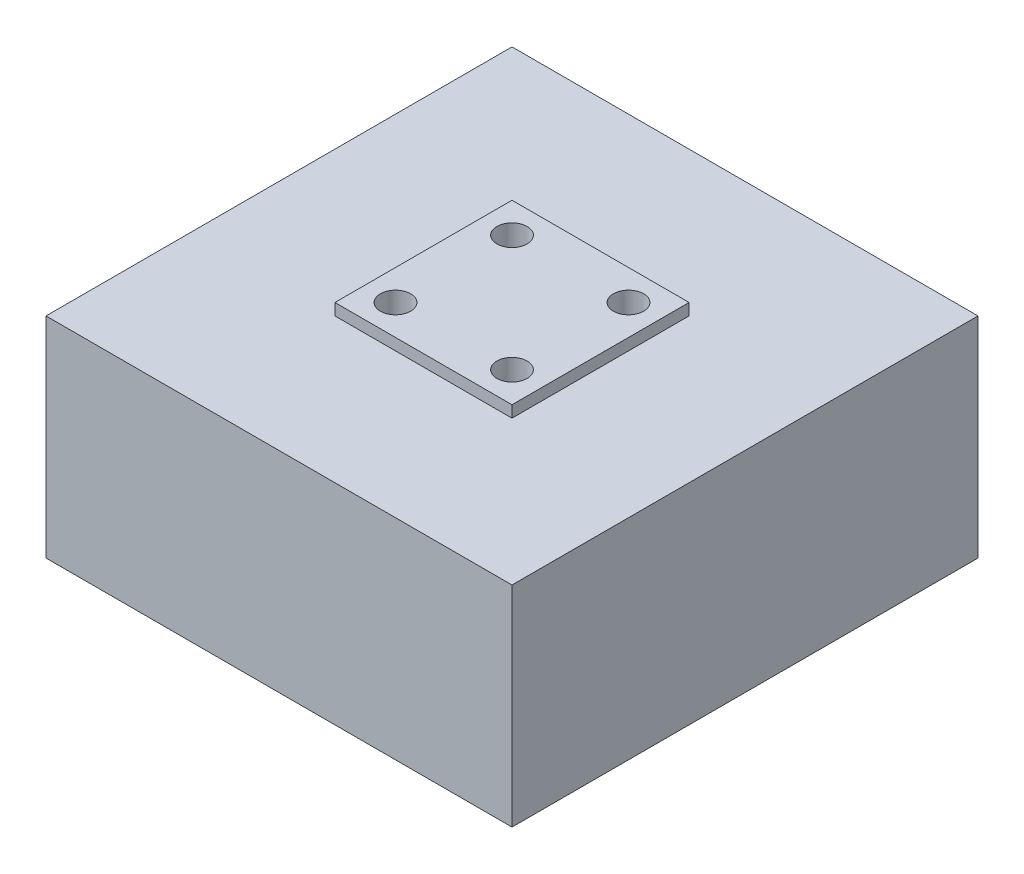
ISO-10303-21;
HEADER;
FILE_DESCRIPTION(('STEP AP214'),'2;1');
FILE_NAME('part.step','',(''),(''),'','','');
FILE_SCHEMA(('AUTOMOTIVE_DESIGN { 1 0 10303 214 1 1 1 1 }'));
ENDSEC;
DATA;
#1=APPLICATION_CONTEXT('core data for automotive mechanical design processes');
#2=APPLICATION_PROTOCOL_DEFINITION('international standard','automotive_design',2000,#1);
#3=PRODUCT_CONTEXT('',#1,'mechanical');
#4=PRODUCT('Part','Part','',(#3));
#5=PRODUCT_RELATED_PRODUCT_CATEGORY('part','',(#4));
#6=PRODUCT_DEFINITION_FORMATION('','',#4);
#7=PRODUCT_DEFINITION_CONTEXT('part definition',#1,'design');
#8=PRODUCT_DEFINITION('design','',#6,#7);
#9=PRODUCT_DEFINITION_SHAPE('','',#8);
#10=(LENGTH_UNIT() NAMED_UNIT(*) SI_UNIT(.MILLI.,.METRE.));
#11=(NAMED_UNIT(*) PLANE_ANGLE_UNIT() SI_UNIT($,.RADIAN.));
#12=(NAMED_UNIT(*) SI_UNIT($,.STERADIAN.) SOLID_ANGLE_UNIT());
#13=UNCERTAINTY_MEASURE_WITH_UNIT(LENGTH_MEASURE(1.E-05),#10,'distance_accuracy_value','');
#14=(GEOMETRIC_REPRESENTATION_CONTEXT(3) GLOBAL_UNCERTAINTY_ASSIGNED_CONTEXT((#13)) GLOBAL_UNIT_ASSIGNED_CONTEXT((#10,
#11,#12)) REPRESENTATION_CONTEXT('',''));
#15=CARTESIAN_POINT('',(0.,0.,0.));
#16=DIRECTION('',(0.,0.,1.));
#17=DIRECTION('',(1.,0.,0.));
#18=AXIS2_PLACEMENT_3D('',#15,#16,#17);
#19=CARTESIAN_POINT('',(20.,20.,20.));
#20=DIRECTION('',(-1.,0.,0.));
#21=DIRECTION('',(0.,0.,1.));
#22=AXIS2_PLACEMENT_3D('',#19,#20,#21);
#23=PLANE('',#22);
#24=DIRECTION('',(0.,0.,1.));
#25=VECTOR('',#24,1.);
#26=CARTESIAN_POINT('',(20.,1.,0.));
#27=LINE('',#26,#25);
#28=CARTESIAN_POINT('',(20.,1.,-20.));
#29=VERTEX_POINT('',#28);
#30=CARTESIAN_POINT('',(20.,1.,20.));
#31=VERTEX_POINT('',#30);
#32=EDGE_CURVE('E54',#29,#31,#27,.T.);
#33=ORIENTED_EDGE('',*,*,#32,.F.);
#34=DIRECTION('',(0.,-1.,0.));
#35=VECTOR('',#34,1.);
#36=CARTESIAN_POINT('',(20.,20.,-20.));
#37=LINE('',#36,#35);
#38=CARTESIAN_POINT('',(20.,19.,-20.));
#39=VERTEX_POINT('',#38);
#40=EDGE_CURVE('E11',#39,#29,#37,.T.);
#41=ORIENTED_EDGE('',*,*,#40,.F.);
#42=DIRECTION('',(0.,0.,-1.));
#43=VECTOR('',#42,1.);
#44=CARTESIAN_POINT('',(20.,19.,0.));
#45=LINE('',#44,#43);
#46=CARTESIAN_POINT('',(20.,19.,20.));
#47=VERTEX_POINT('',#46);
#48=EDGE_CURVE('E208',#47,#39,#45,.T.);
#49=ORIENTED_EDGE('',*,*,#48,.F.);
#50=DIRECTION('',(0.,-1.,0.));
#51=VECTOR('',#50,1.);
#52=CARTESIAN_POINT('',(20.,20.,20.));
#53=LINE('',#52,#51);
#54=EDGE_CURVE('E273',#47,#31,#53,.T.);
#55=ORIENTED_EDGE('',*,*,#54,.T.);
#56=EDGE_LOOP('',(#33,#41,#49,#55));
#57=FACE_BOUND('',#56,.T.);
#58=ADVANCED_FACE('F39',(#57),#23,.F.);
#59=CARTESIAN_POINT('',(-20.,20.,-20.));
#60=DIRECTION('',(0.,0.,1.));
#61=DIRECTION('',(1.,0.,0.));
#62=AXIS2_PLACEMENT_3D('',#59,#60,#61);
#63=PLANE('',#62);
#64=DIRECTION('',(1.,0.,0.));
#65=VECTOR('',#64,1.);
#66=CARTESIAN_POINT('',(0.,1.,-20.));
#67=LINE('',#66,#65);
#68=CARTESIAN_POINT('',(-20.,1.,-20.));
#69=VERTEX_POINT('',#68);
#70=EDGE_CURVE('E163',#69,#29,#67,.T.);
#71=ORIENTED_EDGE('',*,*,#70,.F.);
#72=DIRECTION('',(0.,-1.,0.));
#73=VECTOR('',#72,1.);
#74=CARTESIAN_POINT('',(-20.,20.,-20.));
#75=LINE('',#74,#73);
#76=CARTESIAN_POINT('',(-20.,19.,-20.));
#77=VERTEX_POINT('',#76);
#78=EDGE_CURVE('E47',#77,#69,#75,.T.);
#79=ORIENTED_EDGE('',*,*,#78,.F.);
#80=DIRECTION('',(-1.,0.,0.));
#81=VECTOR('',#80,1.);
#82=CARTESIAN_POINT('',(0.,19.,-20.));
#83=LINE('',#82,#81);
#84=EDGE_CURVE('E211',#39,#77,#83,.T.);
#85=ORIENTED_EDGE('',*,*,#84,.F.);
#86=ORIENTED_EDGE('',*,*,#40,.T.);
#87=EDGE_LOOP('',(#71,#79,#85,#86));
#88=FACE_BOUND('',#87,.T.);
#89=ADVANCED_FACE('F294',(#88),#63,.F.);
#90=CARTESIAN_POINT('',(-20.,20.,20.));
#91=DIRECTION('',(1.,0.,0.));
#92=DIRECTION('',(0.,0.,-1.));
#93=AXIS2_PLACEMENT_3D('',#90,#91,#92);
#94=PLANE('',#93);
#95=DIRECTION('',(0.,0.,-1.));
#96=VECTOR('',#95,1.);
#97=CARTESIAN_POINT('',(-20.,1.,0.));
#98=LINE('',#97,#96);
#99=CARTESIAN_POINT('',(-20.,1.,20.));
#100=VERTEX_POINT('',#99);
#101=EDGE_CURVE('E145',#100,#69,#98,.T.);
#102=ORIENTED_EDGE('',*,*,#101,.F.);
#103=DIRECTION('',(0.,-1.,0.));
#104=VECTOR('',#103,1.);
#105=CARTESIAN_POINT('',(-20.,20.,20.));
#106=LINE('',#105,#104);
#107=CARTESIAN_POINT('',(-20.,19.,20.));
#108=VERTEX_POINT('',#107);
#109=EDGE_CURVE('E280',#108,#100,#106,.T.);
#110=ORIENTED_EDGE('',*,*,#109,.F.);
#111=DIRECTION('',(0.,0.,1.));
#112=VECTOR('',#111,1.);
#113=CARTESIAN_POINT('',(-20.,19.,0.));
#114=LINE('',#113,#112);
#115=EDGE_CURVE('E214',#77,#108,#114,.T.);
#116=ORIENTED_EDGE('',*,*,#115,.F.);
#117=ORIENTED_EDGE('',*,*,#78,.T.);
#118=EDGE_LOOP('',(#102,#110,#116,#117));
#119=FACE_BOUND('',#118,.T.);
#120=ADVANCED_FACE('F289',(#119),#94,.F.);
#121=CARTESIAN_POINT('',(-20.,20.,20.));
#122=DIRECTION('',(0.,0.,-1.));
#123=DIRECTION('',(-1.,0.,0.));
#124=AXIS2_PLACEMENT_3D('',#121,#122,#123);
#125=PLANE('',#124);
#126=DIRECTION('',(-1.,0.,0.));
#127=VECTOR('',#126,1.);
#128=CARTESIAN_POINT('',(0.,1.,20.));
#129=LINE('',#128,#127);
#130=EDGE_CURVE('E168',#31,#100,#129,.T.);
#131=ORIENTED_EDGE('',*,*,#130,.F.);
#132=ORIENTED_EDGE('',*,*,#54,.F.);
#133=DIRECTION('',(1.,0.,0.));
#134=VECTOR('',#133,1.);
#135=CARTESIAN_POINT('',(0.,19.,20.));
#136=LINE('',#135,#134);
#137=EDGE_CURVE('E205',#108,#47,#136,.T.);
#138=ORIENTED_EDGE('',*,*,#137,.F.);
#139=ORIENTED_EDGE('',*,*,#109,.T.);
#140=EDGE_LOOP('',(#131,#132,#138,#139));
#141=FACE_BOUND('',#140,.T.);
#142=ADVANCED_FACE('F301',(#141),#125,.F.);
#143=CARTESIAN_POINT('',(0.,0.,0.));
#144=DIRECTION('',(0.,-1.,0.));
#145=DIRECTION('',(0.,0.,-1.));
#146=AXIS2_PLACEMENT_3D('',#143,#144,#145);
#147=PLANE('',#146);
#148=CARTESIAN_POINT('',(5.,0.,-5.));
#149=DIRECTION('',(0.,1.,0.));
#150=DIRECTION('',(0.,0.,1.));
#151=AXIS2_PLACEMENT_3D('',#148,#149,#150);
#152=CIRCLE('',#151,1.3);
#153=CARTESIAN_POINT('',(5.,0.,-3.7));
#154=VERTEX_POINT('',#153);
#155=EDGE_CURVE('E235',#154,#154,#152,.T.);
#156=ORIENTED_EDGE('',*,*,#155,.T.);
#157=EDGE_LOOP('',(#156));
#158=FACE_BOUND('',#157,.T.);
#159=CARTESIAN_POINT('',(-5.,0.,5.));
#160=DIRECTION('',(0.,1.,0.));
#161=DIRECTION('',(0.,0.,1.));
#162=AXIS2_PLACEMENT_3D('',#159,#160,#161);
#163=CIRCLE('',#162,1.3);
#164=CARTESIAN_POINT('',(-5.,0.,6.3));
#165=VERTEX_POINT('',#164);
#166=EDGE_CURVE('E257',#165,#165,#163,.T.);
#167=ORIENTED_EDGE('',*,*,#166,.T.);
#168=EDGE_LOOP('',(#167));
#169=FACE_BOUND('',#168,.T.);
#170=CARTESIAN_POINT('',(-5.,0.,-5.));
#171=DIRECTION('',(0.,1.,0.));
#172=DIRECTION('',(0.,0.,1.));
#173=AXIS2_PLACEMENT_3D('',#170,#171,#172);
#174=CIRCLE('',#173,1.3);
#175=CARTESIAN_POINT('',(-5.,0.,-3.7));
#176=VERTEX_POINT('',#175);
#177=EDGE_CURVE('E265',#176,#176,#174,.T.);
#178=ORIENTED_EDGE('',*,*,#177,.T.);
#179=EDGE_LOOP('',(#178));
#180=FACE_BOUND('',#179,.T.);
#181=CARTESIAN_POINT('',(5.,0.,5.));
#182=DIRECTION('',(0.,1.,0.));
#183=DIRECTION('',(0.,0.,1.));
#184=AXIS2_PLACEMENT_3D('',#181,#182,#183);
#185=CIRCLE('',#184,1.3);
#186=CARTESIAN_POINT('',(5.,0.,6.3));
#187=VERTEX_POINT('',#186);
#188=EDGE_CURVE('E249',#187,#187,#185,.T.);
#189=ORIENTED_EDGE('',*,*,#188,.T.);
#190=EDGE_LOOP('',(#189));
#191=FACE_BOUND('',#190,.T.);
#192=DIRECTION('',(1.,0.,0.));
#193=VECTOR('',#192,1.);
#194=CARTESIAN_POINT('',(0.,0.,-7.6));
#195=LINE('',#194,#193);
#196=CARTESIAN_POINT('',(-7.6,0.,-7.6));
#197=VERTEX_POINT('',#196);
#198=CARTESIAN_POINT('',(7.6,0.,-7.6));
#199=VERTEX_POINT('',#198);
#200=EDGE_CURVE('E175',#197,#199,#195,.T.);
#201=ORIENTED_EDGE('',*,*,#200,.T.);
#202=DIRECTION('',(0.,0.,1.));
#203=VECTOR('',#202,1.);
#204=CARTESIAN_POINT('',(7.6,0.,0.));
#205=LINE('',#204,#203);
#206=CARTESIAN_POINT('',(7.6,0.,7.6));
#207=VERTEX_POINT('',#206);
#208=EDGE_CURVE('E62',#199,#207,#205,.T.);
#209=ORIENTED_EDGE('',*,*,#208,.T.);
#210=DIRECTION('',(1.,0.,0.));
#211=VECTOR('',#210,1.);
#212=CARTESIAN_POINT('',(0.,0.,7.6));
#213=LINE('',#212,#211);
#214=CARTESIAN_POINT('',(-7.6,0.,7.6));
#215=VERTEX_POINT('',#214);
#216=EDGE_CURVE('E152',#215,#207,#213,.T.);
#217=ORIENTED_EDGE('',*,*,#216,.F.);
#218=DIRECTION('',(0.,0.,1.));
#219=VECTOR('',#218,1.);
#220=CARTESIAN_POINT('',(-7.6,0.,0.));
#221=LINE('',#220,#219);
#222=EDGE_CURVE('E156',#197,#215,#221,.T.);
#223=ORIENTED_EDGE('',*,*,#222,.F.);
#224=EDGE_LOOP('',(#201,#209,#217,#223));
#225=FACE_BOUND('',#224,.T.);
#226=ADVANCED_FACE('F330',(#158,#169,#180,#191,#225),#147,.T.);
#227=CARTESIAN_POINT('',(0.,20.,0.));
#228=DIRECTION('',(0.,-1.,0.));
#229=DIRECTION('',(0.,0.,-1.));
#230=AXIS2_PLACEMENT_3D('',#227,#228,#229);
#231=PLANE('',#230);
#232=CARTESIAN_POINT('',(5.,20.,-5.));
#233=DIRECTION('',(0.,1.,0.));
#234=DIRECTION('',(0.,0.,1.));
#235=AXIS2_PLACEMENT_3D('',#232,#233,#234);
#236=CIRCLE('',#235,1.3);
#237=CARTESIAN_POINT('',(5.,20.,-3.7));
#238=VERTEX_POINT('',#237);
#239=EDGE_CURVE('E245',#238,#238,#236,.T.);
#240=ORIENTED_EDGE('',*,*,#239,.F.);
#241=EDGE_LOOP('',(#240));
#242=FACE_BOUND('',#241,.T.);
#243=CARTESIAN_POINT('',(5.,20.,5.));
#244=DIRECTION('',(0.,1.,0.));
#245=DIRECTION('',(0.,0.,1.));
#246=AXIS2_PLACEMENT_3D('',#243,#244,#245);
#247=CIRCLE('',#246,1.3);
#248=CARTESIAN_POINT('',(5.,20.,6.3));
#249=VERTEX_POINT('',#248);
#250=EDGE_CURVE('E253',#249,#249,#247,.T.);
#251=ORIENTED_EDGE('',*,*,#250,.F.);
#252=EDGE_LOOP('',(#251));
#253=FACE_BOUND('',#252,.T.);
#254=CARTESIAN_POINT('',(-5.,20.,5.));
#255=DIRECTION('',(0.,1.,0.));
#256=DIRECTION('',(0.,0.,1.));
#257=AXIS2_PLACEMENT_3D('',#254,#255,#256);
#258=CIRCLE('',#257,1.3);
#259=CARTESIAN_POINT('',(-5.,20.,6.3));
#260=VERTEX_POINT('',#259);
#261=EDGE_CURVE('E261',#260,#260,#258,.T.);
#262=ORIENTED_EDGE('',*,*,#261,.F.);
#263=EDGE_LOOP('',(#262));
#264=FACE_BOUND('',#263,.T.);
#265=CARTESIAN_POINT('',(-5.,20.,-5.));
#266=DIRECTION('',(0.,1.,0.));
#267=DIRECTION('',(0.,0.,1.));
#268=AXIS2_PLACEMENT_3D('',#265,#266,#267);
#269=CIRCLE('',#268,1.3);
#270=CARTESIAN_POINT('',(-5.,20.,-3.7));
#271=VERTEX_POINT('',#270);
#272=EDGE_CURVE('E269',#271,#271,#269,.T.);
#273=ORIENTED_EDGE('',*,*,#272,.F.);
#274=EDGE_LOOP('',(#273));
#275=FACE_BOUND('',#274,.T.);
#276=DIRECTION('',(0.,0.,-1.));
#277=VECTOR('',#276,1.);
#278=CARTESIAN_POINT('',(7.6,20.,0.));
#279=LINE('',#278,#277);
#280=CARTESIAN_POINT('',(7.6,20.,7.6));
#281=VERTEX_POINT('',#280);
#282=CARTESIAN_POINT('',(7.6,20.,-7.6));
#283=VERTEX_POINT('',#282);
#284=EDGE_CURVE('E184',#281,#283,#279,.T.);
#285=ORIENTED_EDGE('',*,*,#284,.T.);
#286=DIRECTION('',(1.,0.,0.));
#287=VECTOR('',#286,1.);
#288=CARTESIAN_POINT('',(0.,20.,-7.6));
#289=LINE('',#288,#287);
#290=CARTESIAN_POINT('',(-7.6,20.,-7.6));
#291=VERTEX_POINT('',#290);
#292=EDGE_CURVE('E194',#291,#283,#289,.T.);
#293=ORIENTED_EDGE('',*,*,#292,.F.);
#294=DIRECTION('',(0.,0.,-1.));
#295=VECTOR('',#294,1.);
#296=CARTESIAN_POINT('',(-7.6,20.,0.));
#297=LINE('',#296,#295);
#298=CARTESIAN_POINT('',(-7.6,20.,7.6));
#299=VERTEX_POINT('',#298);
#300=EDGE_CURVE('E225',#299,#291,#297,.T.);
#301=ORIENTED_EDGE('',*,*,#300,.F.);
#302=DIRECTION('',(1.,0.,0.));
#303=VECTOR('',#302,1.);
#304=CARTESIAN_POINT('',(0.,20.,7.6));
#305=LINE('',#304,#303);
#306=EDGE_CURVE('E221',#299,#281,#305,.T.);
#307=ORIENTED_EDGE('',*,*,#306,.T.);
#308=EDGE_LOOP('',(#285,#293,#301,#307));
#309=FACE_BOUND('',#308,.T.);
#310=ADVANCED_FACE('F333',(#242,#253,#264,#275,#309),#231,.F.);
#311=CARTESIAN_POINT('',(-5.,20.,-5.));
#312=DIRECTION('',(0.,-1.,0.));
#313=DIRECTION('',(0.,0.,-1.));
#314=AXIS2_PLACEMENT_3D('',#311,#312,#313);
#315=CYLINDRICAL_SURFACE('',#314,1.3);
#316=ORIENTED_EDGE('',*,*,#272,.T.);
#317=EDGE_LOOP('',(#316));
#318=FACE_BOUND('',#317,.T.);
#319=ORIENTED_EDGE('',*,*,#177,.F.);
#320=EDGE_LOOP('',(#319));
#321=FACE_BOUND('',#320,.T.);
#322=ADVANCED_FACE('F337',(#318,#321),#315,.F.);
#323=CARTESIAN_POINT('',(-5.,20.,5.));
#324=DIRECTION('',(0.,-1.,0.));
#325=DIRECTION('',(0.,0.,-1.));
#326=AXIS2_PLACEMENT_3D('',#323,#324,#325);
#327=CYLINDRICAL_SURFACE('',#326,1.3);
#328=ORIENTED_EDGE('',*,*,#261,.T.);
#329=EDGE_LOOP('',(#328));
#330=FACE_BOUND('',#329,.T.);
#331=ORIENTED_EDGE('',*,*,#166,.F.);
#332=EDGE_LOOP('',(#331));
#333=FACE_BOUND('',#332,.T.);
#334=ADVANCED_FACE('F341',(#330,#333),#327,.F.);
#335=CARTESIAN_POINT('',(5.,20.,5.));
#336=DIRECTION('',(0.,-1.,0.));
#337=DIRECTION('',(0.,0.,-1.));
#338=AXIS2_PLACEMENT_3D('',#335,#336,#337);
#339=CYLINDRICAL_SURFACE('',#338,1.3);
#340=ORIENTED_EDGE('',*,*,#250,.T.);
#341=EDGE_LOOP('',(#340));
#342=FACE_BOUND('',#341,.T.);
#343=ORIENTED_EDGE('',*,*,#188,.F.);
#344=EDGE_LOOP('',(#343));
#345=FACE_BOUND('',#344,.T.);
#346=ADVANCED_FACE('F345',(#342,#345),#339,.F.);
#347=CARTESIAN_POINT('',(5.,20.,-5.));
#348=DIRECTION('',(0.,-1.,0.));
#349=DIRECTION('',(0.,0.,-1.));
#350=AXIS2_PLACEMENT_3D('',#347,#348,#349);
#351=CYLINDRICAL_SURFACE('',#350,1.3);
#352=ORIENTED_EDGE('',*,*,#239,.T.);
#353=EDGE_LOOP('',(#352));
#354=FACE_BOUND('',#353,.T.);
#355=ORIENTED_EDGE('',*,*,#155,.F.);
#356=EDGE_LOOP('',(#355));
#357=FACE_BOUND('',#356,.T.);
#358=ADVANCED_FACE('F349',(#354,#357),#351,.F.);
#359=CARTESIAN_POINT('',(7.6,19.,0.));
#360=DIRECTION('',(1.,0.,0.));
#361=DIRECTION('',(0.,0.,-1.));
#362=AXIS2_PLACEMENT_3D('',#359,#360,#361);
#363=PLANE('',#362);
#364=ORIENTED_EDGE('',*,*,#284,.F.);
#365=DIRECTION('',(0.,1.,0.));
#366=VECTOR('',#365,1.);
#367=CARTESIAN_POINT('',(7.6,19.,7.6));
#368=LINE('',#367,#366);
#369=CARTESIAN_POINT('',(7.6,19.,7.6));
#370=VERTEX_POINT('',#369);
#371=EDGE_CURVE('E217',#370,#281,#368,.T.);
#372=ORIENTED_EDGE('',*,*,#371,.F.);
#373=DIRECTION('',(0.,0.,-1.));
#374=VECTOR('',#373,1.);
#375=CARTESIAN_POINT('',(7.6,19.,0.));
#376=LINE('',#375,#374);
#377=CARTESIAN_POINT('',(7.6,19.,-7.6));
#378=VERTEX_POINT('',#377);
#379=EDGE_CURVE('E190',#370,#378,#376,.T.);
#380=ORIENTED_EDGE('',*,*,#379,.T.);
#381=DIRECTION('',(0.,1.,0.));
#382=VECTOR('',#381,1.);
#383=CARTESIAN_POINT('',(7.6,19.,-7.6));
#384=LINE('',#383,#382);
#385=EDGE_CURVE('E232',#378,#283,#384,.T.);
#386=ORIENTED_EDGE('',*,*,#385,.T.);
#387=EDGE_LOOP('',(#364,#372,#380,#386));
#388=FACE_BOUND('',#387,.T.);
#389=ADVANCED_FACE('F353',(#388),#363,.T.);
#390=CARTESIAN_POINT('',(0.,19.,-7.6));
#391=DIRECTION('',(0.,0.,1.));
#392=DIRECTION('',(1.,0.,0.));
#393=AXIS2_PLACEMENT_3D('',#390,#391,#392);
#394=PLANE('',#393);
#395=ORIENTED_EDGE('',*,*,#292,.T.);
#396=ORIENTED_EDGE('',*,*,#385,.F.);
#397=DIRECTION('',(1.,0.,0.));
#398=VECTOR('',#397,1.);
#399=CARTESIAN_POINT('',(0.,19.,-7.6));
#400=LINE('',#399,#398);
#401=CARTESIAN_POINT('',(-7.6,19.,-7.6));
#402=VERTEX_POINT('',#401);
#403=EDGE_CURVE('E201',#402,#378,#400,.T.);
#404=ORIENTED_EDGE('',*,*,#403,.F.);
#405=DIRECTION('',(0.,1.,0.));
#406=VECTOR('',#405,1.);
#407=CARTESIAN_POINT('',(-7.6,19.,-7.6));
#408=LINE('',#407,#406);
#409=EDGE_CURVE('E236',#402,#291,#408,.T.);
#410=ORIENTED_EDGE('',*,*,#409,.T.);
#411=EDGE_LOOP('',(#395,#396,#404,#410));
#412=FACE_BOUND('',#411,.T.);
#413=ADVANCED_FACE('F356',(#412),#394,.F.);
#414=CARTESIAN_POINT('',(-7.6,19.,0.));
#415=DIRECTION('',(1.,0.,0.));
#416=DIRECTION('',(0.,0.,-1.));
#417=AXIS2_PLACEMENT_3D('',#414,#415,#416);
#418=PLANE('',#417);
#419=ORIENTED_EDGE('',*,*,#300,.T.);
#420=ORIENTED_EDGE('',*,*,#409,.F.);
#421=DIRECTION('',(0.,0.,-1.));
#422=VECTOR('',#421,1.);
#423=CARTESIAN_POINT('',(-7.6,19.,0.));
#424=LINE('',#423,#422);
#425=CARTESIAN_POINT('',(-7.6,19.,7.6));
#426=VERTEX_POINT('',#425);
#427=EDGE_CURVE('E197',#426,#402,#424,.T.);
#428=ORIENTED_EDGE('',*,*,#427,.F.);
#429=DIRECTION('',(0.,1.,0.));
#430=VECTOR('',#429,1.);
#431=CARTESIAN_POINT('',(-7.6,19.,7.6));
#432=LINE('',#431,#430);
#433=EDGE_CURVE('E239',#426,#299,#432,.T.);
#434=ORIENTED_EDGE('',*,*,#433,.T.);
#435=EDGE_LOOP('',(#419,#420,#428,#434));
#436=FACE_BOUND('',#435,.T.);
#437=ADVANCED_FACE('F314',(#436),#418,.F.);
#438=CARTESIAN_POINT('',(0.,19.,7.6));
#439=DIRECTION('',(0.,0.,1.));
#440=DIRECTION('',(1.,0.,0.));
#441=AXIS2_PLACEMENT_3D('',#438,#439,#440);
#442=PLANE('',#441);
#443=ORIENTED_EDGE('',*,*,#306,.F.);
#444=ORIENTED_EDGE('',*,*,#433,.F.);
#445=DIRECTION('',(1.,0.,0.));
#446=VECTOR('',#445,1.);
#447=CARTESIAN_POINT('',(0.,19.,7.6));
#448=LINE('',#447,#446);
#449=EDGE_CURVE('E193',#426,#370,#448,.T.);
#450=ORIENTED_EDGE('',*,*,#449,.T.);
#451=ORIENTED_EDGE('',*,*,#371,.T.);
#452=EDGE_LOOP('',(#443,#444,#450,#451));
#453=FACE_BOUND('',#452,.T.);
#454=ADVANCED_FACE('F305',(#453),#442,.T.);
#455=CARTESIAN_POINT('',(0.,19.,0.));
#456=DIRECTION('',(0.,1.,0.));
#457=DIRECTION('',(0.,0.,1.));
#458=AXIS2_PLACEMENT_3D('',#455,#456,#457);
#459=PLANE('',#458);
#460=ORIENTED_EDGE('',*,*,#379,.F.);
#461=ORIENTED_EDGE('',*,*,#449,.F.);
#462=ORIENTED_EDGE('',*,*,#427,.T.);
#463=ORIENTED_EDGE('',*,*,#403,.T.);
#464=EDGE_LOOP('',(#460,#461,#462,#463));
#465=FACE_BOUND('',#464,.T.);
#466=ORIENTED_EDGE('',*,*,#137,.T.);
#467=ORIENTED_EDGE('',*,*,#48,.T.);
#468=ORIENTED_EDGE('',*,*,#84,.T.);
#469=ORIENTED_EDGE('',*,*,#115,.T.);
#470=EDGE_LOOP('',(#466,#467,#468,#469));
#471=FACE_BOUND('',#470,.T.);
#472=ADVANCED_FACE('F303',(#465,#471),#459,.T.);
#473=CARTESIAN_POINT('',(7.6,1.,0.));
#474=DIRECTION('',(1.,0.,0.));
#475=DIRECTION('',(0.,0.,-1.));
#476=AXIS2_PLACEMENT_3D('',#473,#474,#475);
#477=PLANE('',#476);
#478=ORIENTED_EDGE('',*,*,#208,.F.);
#479=DIRECTION('',(0.,-1.,0.));
#480=VECTOR('',#479,1.);
#481=CARTESIAN_POINT('',(7.6,1.,-7.6));
#482=LINE('',#481,#480);
#483=CARTESIAN_POINT('',(7.6,1.,-7.6));
#484=VERTEX_POINT('',#483);
#485=EDGE_CURVE('E131',#484,#199,#482,.T.);
#486=ORIENTED_EDGE('',*,*,#485,.F.);
#487=DIRECTION('',(0.,0.,1.));
#488=VECTOR('',#487,1.);
#489=CARTESIAN_POINT('',(7.6,1.,0.));
#490=LINE('',#489,#488);
#491=CARTESIAN_POINT('',(7.6,1.,7.6));
#492=VERTEX_POINT('',#491);
#493=EDGE_CURVE('E140',#484,#492,#490,.T.);
#494=ORIENTED_EDGE('',*,*,#493,.T.);
#495=DIRECTION('',(0.,-1.,0.));
#496=VECTOR('',#495,1.);
#497=CARTESIAN_POINT('',(7.6,1.,7.6));
#498=LINE('',#497,#496);
#499=EDGE_CURVE('E181',#492,#207,#498,.T.);
#500=ORIENTED_EDGE('',*,*,#499,.T.);
#501=EDGE_LOOP('',(#478,#486,#494,#500));
#502=FACE_BOUND('',#501,.T.);
#503=ADVANCED_FACE('F142',(#502),#477,.T.);
#504=CARTESIAN_POINT('',(0.,1.,7.6));
#505=DIRECTION('',(0.,0.,-1.));
#506=DIRECTION('',(-1.,0.,0.));
#507=AXIS2_PLACEMENT_3D('',#504,#505,#506);
#508=PLANE('',#507);
#509=ORIENTED_EDGE('',*,*,#216,.T.);
#510=ORIENTED_EDGE('',*,*,#499,.F.);
#511=DIRECTION('',(1.,0.,0.));
#512=VECTOR('',#511,1.);
#513=CARTESIAN_POINT('',(0.,1.,7.6));
#514=LINE('',#513,#512);
#515=CARTESIAN_POINT('',(-7.6,1.,7.6));
#516=VERTEX_POINT('',#515);
#517=EDGE_CURVE('E150',#516,#492,#514,.T.);
#518=ORIENTED_EDGE('',*,*,#517,.F.);
#519=DIRECTION('',(0.,-1.,0.));
#520=VECTOR('',#519,1.);
#521=CARTESIAN_POINT('',(-7.6,1.,7.6));
#522=LINE('',#521,#520);
#523=EDGE_CURVE('E185',#516,#215,#522,.T.);
#524=ORIENTED_EDGE('',*,*,#523,.T.);
#525=EDGE_LOOP('',(#509,#510,#518,#524));
#526=FACE_BOUND('',#525,.T.);
#527=ADVANCED_FACE('F312',(#526),#508,.F.);
#528=CARTESIAN_POINT('',(-7.6,1.,0.));
#529=DIRECTION('',(1.,0.,0.));
#530=DIRECTION('',(0.,0.,-1.));
#531=AXIS2_PLACEMENT_3D('',#528,#529,#530);
#532=PLANE('',#531);
#533=ORIENTED_EDGE('',*,*,#222,.T.);
#534=ORIENTED_EDGE('',*,*,#523,.F.);
#535=DIRECTION('',(0.,0.,1.));
#536=VECTOR('',#535,1.);
#537=CARTESIAN_POINT('',(-7.6,1.,0.));
#538=LINE('',#537,#536);
#539=CARTESIAN_POINT('',(-7.6,1.,-7.6));
#540=VERTEX_POINT('',#539);
#541=EDGE_CURVE('E139',#540,#516,#538,.T.);
#542=ORIENTED_EDGE('',*,*,#541,.F.);
#543=DIRECTION('',(0.,-1.,0.));
#544=VECTOR('',#543,1.);
#545=CARTESIAN_POINT('',(-7.6,1.,-7.6));
#546=LINE('',#545,#544);
#547=EDGE_CURVE('E133',#540,#197,#546,.T.);
#548=ORIENTED_EDGE('',*,*,#547,.T.);
#549=EDGE_LOOP('',(#533,#534,#542,#548));
#550=FACE_BOUND('',#549,.T.);
#551=ADVANCED_FACE('F429',(#550),#532,.F.);
#552=CARTESIAN_POINT('',(0.,1.,-7.6));
#553=DIRECTION('',(0.,0.,-1.));
#554=DIRECTION('',(-1.,0.,0.));
#555=AXIS2_PLACEMENT_3D('',#552,#553,#554);
#556=PLANE('',#555);
#557=ORIENTED_EDGE('',*,*,#200,.F.);
#558=ORIENTED_EDGE('',*,*,#547,.F.);
#559=DIRECTION('',(1.,0.,0.));
#560=VECTOR('',#559,1.);
#561=CARTESIAN_POINT('',(0.,1.,-7.6));
#562=LINE('',#561,#560);
#563=EDGE_CURVE('E128',#540,#484,#562,.T.);
#564=ORIENTED_EDGE('',*,*,#563,.T.);
#565=ORIENTED_EDGE('',*,*,#485,.T.);
#566=EDGE_LOOP('',(#557,#558,#564,#565));
#567=FACE_BOUND('',#566,.T.);
#568=ADVANCED_FACE('F130',(#567),#556,.T.);
#569=CARTESIAN_POINT('',(0.,1.,0.));
#570=DIRECTION('',(0.,-1.,0.));
#571=DIRECTION('',(0.,0.,-1.));
#572=AXIS2_PLACEMENT_3D('',#569,#570,#571);
#573=PLANE('',#572);
#574=ORIENTED_EDGE('',*,*,#493,.F.);
#575=ORIENTED_EDGE('',*,*,#563,.F.);
#576=ORIENTED_EDGE('',*,*,#541,.T.);
#577=ORIENTED_EDGE('',*,*,#517,.T.);
#578=EDGE_LOOP('',(#574,#575,#576,#577));
#579=FACE_BOUND('',#578,.T.);
#580=ORIENTED_EDGE('',*,*,#70,.T.);
#581=ORIENTED_EDGE('',*,*,#32,.T.);
#582=ORIENTED_EDGE('',*,*,#130,.T.);
#583=ORIENTED_EDGE('',*,*,#101,.T.);
#584=EDGE_LOOP('',(#580,#581,#582,#583));
#585=FACE_BOUND('',#584,.T.);
#586=ADVANCED_FACE('F148',(#579,#585),#573,.T.);
#587=CLOSED_SHELL('',(#58,#89,#120,#142,#226,#310,#322,#334,#346,#358,#389,#413,#437,#454,#472,
#503,#527,#551,#568,#586));
#588=MANIFOLD_SOLID_BREP('B2',#587);
#589=ADVANCED_BREP_SHAPE_REPRESENTATION('',(#18,#588),#14);
#590=SHAPE_DEFINITION_REPRESENTATION(#9,#589);
ENDSEC;
END-ISO-10303-21;
